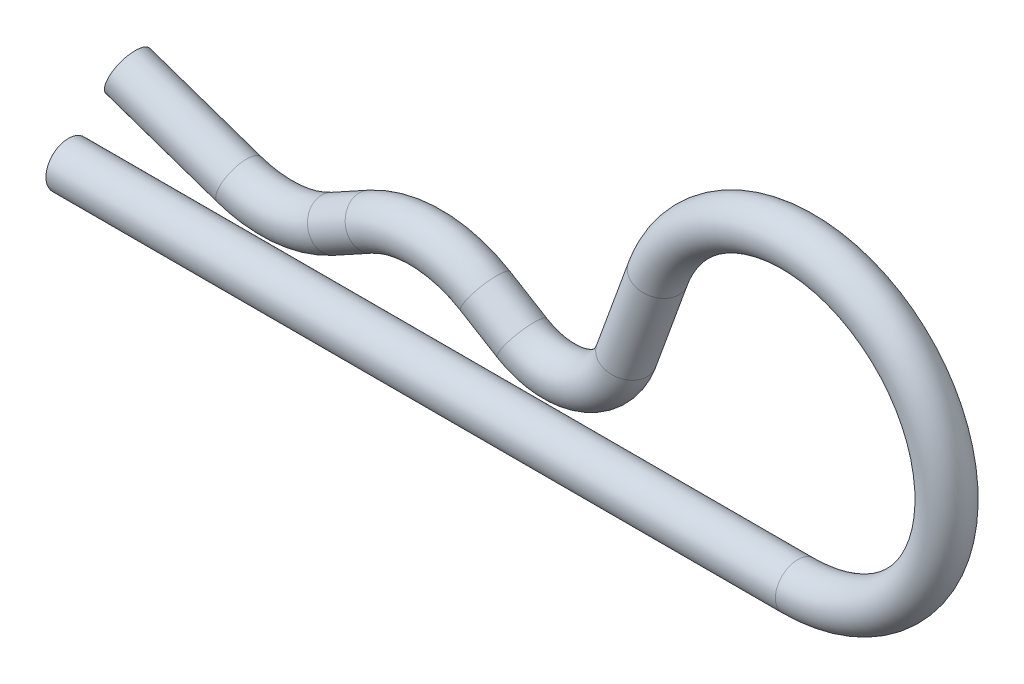
ISO-10303-21;
HEADER;
FILE_DESCRIPTION(('STEP AP214'),'2;1');
FILE_NAME('part.step','',(''),(''),'','','');
FILE_SCHEMA(('AUTOMOTIVE_DESIGN { 1 0 10303 214 1 1 1 1 }'));
ENDSEC;
DATA;
#1=APPLICATION_CONTEXT('core data for automotive mechanical design processes');
#2=APPLICATION_PROTOCOL_DEFINITION('international standard','automotive_design',2000,#1);
#3=PRODUCT_CONTEXT('',#1,'mechanical');
#4=PRODUCT('Part','Part','',(#3));
#5=PRODUCT_RELATED_PRODUCT_CATEGORY('part','',(#4));
#6=PRODUCT_DEFINITION_FORMATION('','',#4);
#7=PRODUCT_DEFINITION_CONTEXT('part definition',#1,'design');
#8=PRODUCT_DEFINITION('design','',#6,#7);
#9=PRODUCT_DEFINITION_SHAPE('','',#8);
#10=(LENGTH_UNIT() NAMED_UNIT(*) SI_UNIT(.MILLI.,.METRE.));
#11=(NAMED_UNIT(*) PLANE_ANGLE_UNIT() SI_UNIT($,.RADIAN.));
#12=(NAMED_UNIT(*) SI_UNIT($,.STERADIAN.) SOLID_ANGLE_UNIT());
#13=UNCERTAINTY_MEASURE_WITH_UNIT(LENGTH_MEASURE(1.E-05),#10,'distance_accuracy_value','');
#14=(GEOMETRIC_REPRESENTATION_CONTEXT(3) GLOBAL_UNCERTAINTY_ASSIGNED_CONTEXT((#13)) GLOBAL_UNIT_ASSIGNED_CONTEXT((#10,
#11,#12)) REPRESENTATION_CONTEXT('',''));
#15=CARTESIAN_POINT('',(0.,0.,0.));
#16=DIRECTION('',(0.,0.,1.));
#17=DIRECTION('',(1.,0.,0.));
#18=AXIS2_PLACEMENT_3D('',#15,#16,#17);
#19=CARTESIAN_POINT('',(4.,7.43403579141138,0.));
#20=DIRECTION('',(0.945614573232272,-0.325289223446993,0.));
#21=DIRECTION('',(0.325289223446993,0.945614573232272,0.));
#22=AXIS2_PLACEMENT_3D('',#19,#20,#21);
#23=PLANE('',#22);
#24=CARTESIAN_POINT('',(4.,7.43403579141138,0.));
#25=DIRECTION('',(-0.945614573232272,0.325289223446993,0.));
#26=DIRECTION('',(-0.325289223446993,-0.945614573232272,0.));
#27=AXIS2_PLACEMENT_3D('',#24,#25,#26);
#28=CIRCLE('',#27,1.5);
#29=CARTESIAN_POINT('',(3.51206616482951,6.01561393156297,0.));
#30=VERTEX_POINT('',#29);
#31=EDGE_CURVE('E18',#30,#30,#28,.F.);
#32=ORIENTED_EDGE('',*,*,#31,.F.);
#33=EDGE_LOOP('',(#32));
#34=FACE_BOUND('',#33,.T.);
#35=ADVANCED_FACE('F15',(#34),#23,.F.);
#36=CARTESIAN_POINT('',(11.4790085182858,4.86127418014436,0.));
#37=DIRECTION('',(-0.945614573232272,0.325289223446993,0.));
#38=DIRECTION('',(-0.325289223446993,-0.945614573232272,0.));
#39=AXIS2_PLACEMENT_3D('',#36,#37,#38);
#40=CYLINDRICAL_SURFACE('',#39,1.5);
#41=CARTESIAN_POINT('',(11.4790085182858,4.86127418014437,0.));
#42=DIRECTION('',(-0.945614573232272,0.325289223446993,0.));
#43=DIRECTION('',(-0.325289223446993,-0.945614573232272,0.));
#44=AXIS2_PLACEMENT_3D('',#41,#42,#43);
#45=CIRCLE('',#44,1.5);
#46=CARTESIAN_POINT('',(10.9910746831153,3.44285232029596,0.));
#47=VERTEX_POINT('',#46);
#48=EDGE_CURVE('E31',#47,#47,#45,.F.);
#49=ORIENTED_EDGE('',*,*,#48,.F.);
#50=EDGE_LOOP('',(#49));
#51=FACE_BOUND('',#50,.T.);
#52=ORIENTED_EDGE('',*,*,#31,.T.);
#53=EDGE_LOOP('',(#52));
#54=FACE_BOUND('',#53,.T.);
#55=ADVANCED_FACE('F44',(#51,#54),#40,.T.);
#56=CARTESIAN_POINT('',(14.,12.1897871226945,0.));
#57=DIRECTION('',(0.,0.,-1.));
#58=DIRECTION('',(-1.,0.,0.));
#59=AXIS2_PLACEMENT_3D('',#56,#57,#58);
#60=TOROIDAL_SURFACE('',#59,7.74999999999999,1.5);
#61=CARTESIAN_POINT('',(17.7346988936069,5.39901955384844,0.));
#62=DIRECTION('',(-0.87622807339949,-0.481896631433151,0.));
#63=DIRECTION('',(0.481896631433151,-0.87622807339949,0.));
#64=AXIS2_PLACEMENT_3D('',#61,#62,#63);
#65=CIRCLE('',#64,1.5);
#66=CARTESIAN_POINT('',(18.4575438407567,4.0846774437492,0.));
#67=VERTEX_POINT('',#66);
#68=EDGE_CURVE('E34',#67,#67,#65,.F.);
#69=ORIENTED_EDGE('',*,*,#68,.F.);
#70=EDGE_LOOP('',(#69));
#71=FACE_BOUND('',#70,.T.);
#72=ORIENTED_EDGE('',*,*,#48,.T.);
#73=EDGE_LOOP('',(#72));
#74=FACE_BOUND('',#73,.T.);
#75=ADVANCED_FACE('F40',(#71,#74),#60,.T.);
#76=CARTESIAN_POINT('',(20.2653011063931,6.79076756884605,0.));
#77=DIRECTION('',(-0.87622807339949,-0.481896631433151,0.));
#78=DIRECTION('',(0.481896631433151,-0.87622807339949,0.));
#79=AXIS2_PLACEMENT_3D('',#76,#77,#78);
#80=CYLINDRICAL_SURFACE('',#79,1.5);
#81=CARTESIAN_POINT('',(20.2653011063931,6.79076756884605,0.));
#82=DIRECTION('',(-0.87622807339949,-0.481896631433151,0.));
#83=DIRECTION('',(-0.481896631433151,0.87622807339949,0.));
#84=AXIS2_PLACEMENT_3D('',#81,#82,#83);
#85=CIRCLE('',#84,1.5);
#86=CARTESIAN_POINT('',(19.5424561592434,8.10510967894529,0.));
#87=VERTEX_POINT('',#86);
#88=EDGE_CURVE('E107',#87,#87,#85,.F.);
#89=ORIENTED_EDGE('',*,*,#88,.F.);
#90=EDGE_LOOP('',(#89));
#91=FACE_BOUND('',#90,.T.);
#92=ORIENTED_EDGE('',*,*,#68,.T.);
#93=EDGE_LOOP('',(#92));
#94=FACE_BOUND('',#93,.T.);
#95=ADVANCED_FACE('F43',(#91,#94),#80,.T.);
#96=CARTESIAN_POINT('',(24.,0.,0.));
#97=DIRECTION('',(0.,0.,1.));
#98=DIRECTION('',(1.,0.,0.));
#99=AXIS2_PLACEMENT_3D('',#96,#97,#98);
#100=TOROIDAL_SURFACE('',#99,7.75,1.5);
#101=CARTESIAN_POINT('',(28.0136277790127,6.62972790177226,0.));
#102=DIRECTION('',(-0.855448761519,0.517887455356479,0.));
#103=DIRECTION('',(-0.517887455356479,-0.855448761519,0.));
#104=AXIS2_PLACEMENT_3D('',#101,#102,#103);
#105=CIRCLE('',#104,1.5);
#106=CARTESIAN_POINT('',(27.236796595978,5.34655475949376,0.));
#107=VERTEX_POINT('',#106);
#108=EDGE_CURVE('E110',#107,#107,#105,.F.);
#109=ORIENTED_EDGE('',*,*,#108,.F.);
#110=EDGE_LOOP('',(#109));
#111=FACE_BOUND('',#110,.T.);
#112=ORIENTED_EDGE('',*,*,#88,.T.);
#113=EDGE_LOOP('',(#112));
#114=FACE_BOUND('',#113,.T.);
#115=ADVANCED_FACE('F97',(#111,#114),#100,.T.);
#116=CARTESIAN_POINT('',(30.4842180220603,5.13403610612514,0.));
#117=DIRECTION('',(-0.855448761519,0.517887455356479,0.));
#118=DIRECTION('',(-0.517887455356479,-0.855448761519,0.));
#119=AXIS2_PLACEMENT_3D('',#116,#117,#118);
#120=CYLINDRICAL_SURFACE('',#119,1.5);
#121=CARTESIAN_POINT('',(30.4842180220603,5.13403610612514,0.));
#122=DIRECTION('',(-0.855448761519,0.51788745535648,0.));
#123=DIRECTION('',(-0.51788745535648,-0.855448761519,0.));
#124=AXIS2_PLACEMENT_3D('',#121,#122,#123);
#125=CIRCLE('',#124,1.5);
#126=CARTESIAN_POINT('',(29.7073868390256,3.85086296384664,0.));
#127=VERTEX_POINT('',#126);
#128=EDGE_CURVE('E85',#127,#127,#125,.F.);
#129=ORIENTED_EDGE('',*,*,#128,.F.);
#130=EDGE_LOOP('',(#129));
#131=FACE_BOUND('',#130,.T.);
#132=ORIENTED_EDGE('',*,*,#108,.T.);
#133=EDGE_LOOP('',(#132));
#134=FACE_BOUND('',#133,.T.);
#135=ADVANCED_FACE('F94',(#131,#134),#120,.T.);
#136=CARTESIAN_POINT('',(32.9715217850093,9.24257532932694,0.));
#137=DIRECTION('',(0.,0.,-1.));
#138=DIRECTION('',(-1.,0.,0.));
#139=AXIS2_PLACEMENT_3D('',#136,#137,#138);
#140=TOROIDAL_SURFACE('',#139,4.80278820663246,1.5);
#141=CARTESIAN_POINT('',(37.4846664219794,7.59992501853167,0.));
#142=DIRECTION('',(-0.34202014332567,-0.939692620785908,0.));
#143=DIRECTION('',(0.939692620785908,-0.34202014332567,0.));
#144=AXIS2_PLACEMENT_3D('',#141,#142,#143);
#145=CIRCLE('',#144,1.5);
#146=CARTESIAN_POINT('',(38.8942053531583,7.08689480354317,0.));
#147=VERTEX_POINT('',#146);
#148=EDGE_CURVE('E80',#147,#147,#145,.F.);
#149=ORIENTED_EDGE('',*,*,#148,.F.);
#150=EDGE_LOOP('',(#149));
#151=FACE_BOUND('',#150,.T.);
#152=ORIENTED_EDGE('',*,*,#128,.T.);
#153=EDGE_LOOP('',(#152));
#154=FACE_BOUND('',#153,.T.);
#155=ADVANCED_FACE('F91',(#151,#154),#140,.T.);
#156=CARTESIAN_POINT('',(39.6030737921409,13.4202014332567,0.));
#157=DIRECTION('',(-0.34202014332567,-0.939692620785908,0.));
#158=DIRECTION('',(0.939692620785908,-0.34202014332567,0.));
#159=AXIS2_PLACEMENT_3D('',#156,#157,#158);
#160=CYLINDRICAL_SURFACE('',#159,1.5);
#161=CARTESIAN_POINT('',(39.6030737921409,13.4202014332567,0.));
#162=DIRECTION('',(-0.342020143325669,-0.939692620785908,0.));
#163=DIRECTION('',(-0.939692620785908,0.342020143325669,0.));
#164=AXIS2_PLACEMENT_3D('',#161,#162,#163);
#165=CIRCLE('',#164,1.5);
#166=CARTESIAN_POINT('',(38.193534860962,13.9332316482452,0.));
#167=VERTEX_POINT('',#166);
#168=EDGE_CURVE('E26',#167,#167,#165,.F.);
#169=ORIENTED_EDGE('',*,*,#168,.F.);
#170=EDGE_LOOP('',(#169));
#171=FACE_BOUND('',#170,.T.);
#172=ORIENTED_EDGE('',*,*,#148,.T.);
#173=EDGE_LOOP('',(#172));
#174=FACE_BOUND('',#173,.T.);
#175=ADVANCED_FACE('F71',(#171,#174),#160,.T.);
#176=CARTESIAN_POINT('',(49.,10.,0.));
#177=DIRECTION('',(0.,0.,1.));
#178=DIRECTION('',(1.,0.,0.));
#179=AXIS2_PLACEMENT_3D('',#176,#177,#178);
#180=TOROIDAL_SURFACE('',#179,10.,1.5);
#181=CARTESIAN_POINT('',(49.,0.,0.));
#182=DIRECTION('',(1.,0.,0.));
#183=DIRECTION('',(0.,0.,-1.));
#184=AXIS2_PLACEMENT_3D('',#181,#182,#183);
#185=CIRCLE('',#184,1.5);
#186=CARTESIAN_POINT('',(49.,0.,-1.5));
#187=VERTEX_POINT('',#186);
#188=EDGE_CURVE('E22',#187,#187,#185,.F.);
#189=ORIENTED_EDGE('',*,*,#188,.F.);
#190=EDGE_LOOP('',(#189));
#191=FACE_BOUND('',#190,.T.);
#192=ORIENTED_EDGE('',*,*,#168,.T.);
#193=EDGE_LOOP('',(#192));
#194=FACE_BOUND('',#193,.T.);
#195=ADVANCED_FACE('F63',(#191,#194),#180,.T.);
#196=CARTESIAN_POINT('',(0.,0.,0.));
#197=DIRECTION('',(-1.,0.,0.));
#198=DIRECTION('',(0.,0.,1.));
#199=AXIS2_PLACEMENT_3D('',#196,#197,#198);
#200=PLANE('',#199);
#201=CARTESIAN_POINT('',(0.,0.,0.));
#202=DIRECTION('',(1.,0.,0.));
#203=DIRECTION('',(0.,0.,-1.));
#204=AXIS2_PLACEMENT_3D('',#201,#202,#203);
#205=CIRCLE('',#204,1.5);
#206=CARTESIAN_POINT('',(0.,0.,-1.5));
#207=VERTEX_POINT('',#206);
#208=EDGE_CURVE('E10',#207,#207,#205,.T.);
#209=ORIENTED_EDGE('',*,*,#208,.F.);
#210=EDGE_LOOP('',(#209));
#211=FACE_BOUND('',#210,.T.);
#212=ADVANCED_FACE('F58',(#211),#200,.T.);
#213=CARTESIAN_POINT('',(0.,0.,0.));
#214=DIRECTION('',(1.,0.,0.));
#215=DIRECTION('',(0.,0.,-1.));
#216=AXIS2_PLACEMENT_3D('',#213,#214,#215);
#217=CYLINDRICAL_SURFACE('',#216,1.5);
#218=ORIENTED_EDGE('',*,*,#208,.T.);
#219=EDGE_LOOP('',(#218));
#220=FACE_BOUND('',#219,.T.);
#221=ORIENTED_EDGE('',*,*,#188,.T.);
#222=EDGE_LOOP('',(#221));
#223=FACE_BOUND('',#222,.T.);
#224=ADVANCED_FACE('F56',(#220,#223),#217,.T.);
#225=CLOSED_SHELL('',(#35,#55,#75,#95,#115,#135,#155,#175,#195,#212,#224));
#226=MANIFOLD_SOLID_BREP('B1',#225);
#227=ADVANCED_BREP_SHAPE_REPRESENTATION('',(#18,#226),#14);
#228=SHAPE_DEFINITION_REPRESENTATION(#9,#227);
ENDSEC;
END-ISO-10303-21;
